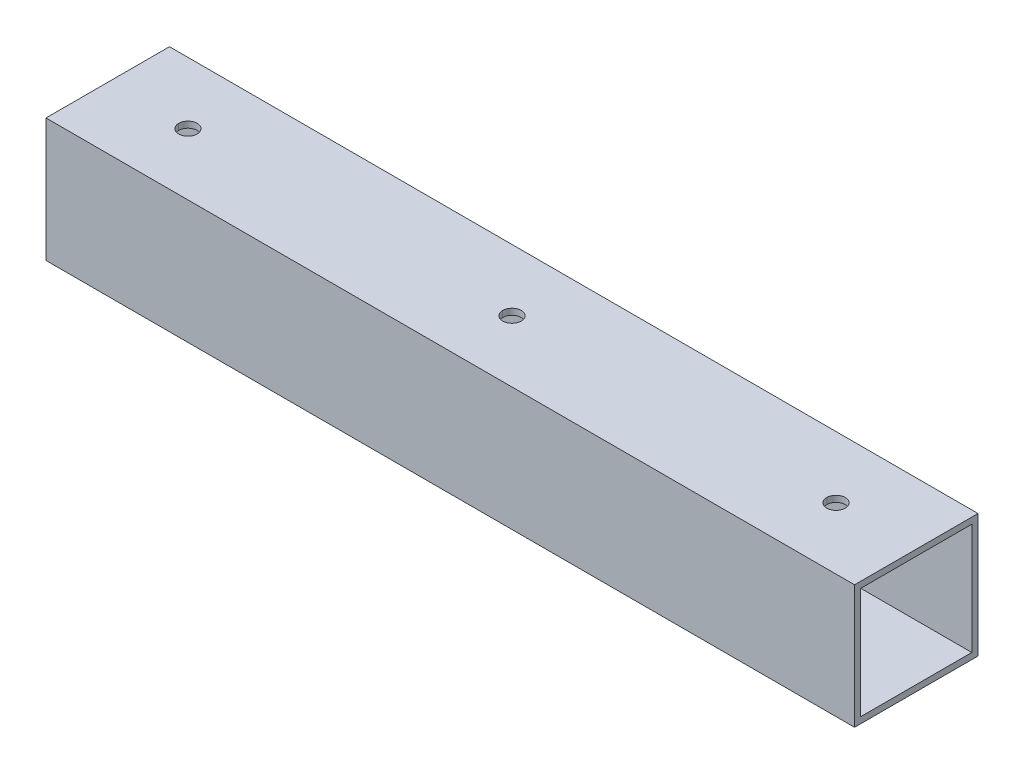
ISO-10303-21;
HEADER;
FILE_DESCRIPTION(('STEP AP214'),'2;1');
FILE_NAME('part.step','',(''),(''),'','','');
FILE_SCHEMA(('AUTOMOTIVE_DESIGN { 1 0 10303 214 1 1 1 1 }'));
ENDSEC;
DATA;
#1=APPLICATION_CONTEXT('core data for automotive mechanical design processes');
#2=APPLICATION_PROTOCOL_DEFINITION('international standard','automotive_design',2000,#1);
#3=PRODUCT_CONTEXT('',#1,'mechanical');
#4=PRODUCT('Part','Part','',(#3));
#5=PRODUCT_RELATED_PRODUCT_CATEGORY('part','',(#4));
#6=PRODUCT_DEFINITION_FORMATION('','',#4);
#7=PRODUCT_DEFINITION_CONTEXT('part definition',#1,'design');
#8=PRODUCT_DEFINITION('design','',#6,#7);
#9=PRODUCT_DEFINITION_SHAPE('','',#8);
#10=(LENGTH_UNIT() NAMED_UNIT(*) SI_UNIT(.MILLI.,.METRE.));
#11=(NAMED_UNIT(*) PLANE_ANGLE_UNIT() SI_UNIT($,.RADIAN.));
#12=(NAMED_UNIT(*) SI_UNIT($,.STERADIAN.) SOLID_ANGLE_UNIT());
#13=UNCERTAINTY_MEASURE_WITH_UNIT(LENGTH_MEASURE(1.E-05),#10,'distance_accuracy_value','');
#14=(GEOMETRIC_REPRESENTATION_CONTEXT(3) GLOBAL_UNCERTAINTY_ASSIGNED_CONTEXT((#13)) GLOBAL_UNIT_ASSIGNED_CONTEXT((#10,
#11,#12)) REPRESENTATION_CONTEXT('',''));
#15=CARTESIAN_POINT('',(0.,0.,0.));
#16=DIRECTION('',(0.,0.,1.));
#17=DIRECTION('',(1.,0.,0.));
#18=AXIS2_PLACEMENT_3D('',#15,#16,#17);
#19=CARTESIAN_POINT('',(-52.5,10.,0.));
#20=DIRECTION('',(0.,1.,0.));
#21=DIRECTION('',(-1.,0.,0.));
#22=AXIS2_PLACEMENT_3D('',#19,#20,#21);
#23=CYLINDRICAL_SURFACE('',#22,1.5);
#24=DIRECTION('',(0.,-1.,0.));
#25=VECTOR('',#24,1.);
#26=CARTESIAN_POINT('',(-51.,-9.,0.));
#27=LINE('',#26,#25);
#28=CARTESIAN_POINT('',(-51.,-9.,0.));
#29=VERTEX_POINT('',#28);
#30=CARTESIAN_POINT('',(-51.,-10.,0.));
#31=VERTEX_POINT('',#30);
#32=EDGE_CURVE('E20',#29,#31,#27,.T.);
#33=ORIENTED_EDGE('',*,*,#32,.F.);
#34=CARTESIAN_POINT('',(-52.5,-9.,0.));
#35=DIRECTION('',(0.,1.,0.));
#36=DIRECTION('',(1.,0.,0.));
#37=AXIS2_PLACEMENT_3D('',#34,#35,#36);
#38=CIRCLE('',#37,1.5);
#39=CARTESIAN_POINT('',(-54.,-9.,0.));
#40=VERTEX_POINT('',#39);
#41=EDGE_CURVE('E34',#29,#40,#38,.T.);
#42=ORIENTED_EDGE('',*,*,#41,.T.);
#43=DIRECTION('',(0.,-1.,0.));
#44=VECTOR('',#43,1.);
#45=CARTESIAN_POINT('',(-54.,-9.,0.));
#46=LINE('',#45,#44);
#47=CARTESIAN_POINT('',(-54.,-10.,0.));
#48=VERTEX_POINT('',#47);
#49=EDGE_CURVE('E11',#40,#48,#46,.T.);
#50=ORIENTED_EDGE('',*,*,#49,.T.);
#51=CARTESIAN_POINT('',(-52.5,-10.,0.));
#52=DIRECTION('',(0.,1.,0.));
#53=DIRECTION('',(1.,0.,0.));
#54=AXIS2_PLACEMENT_3D('',#51,#52,#53);
#55=CIRCLE('',#54,1.5);
#56=EDGE_CURVE('E203',#31,#48,#55,.T.);
#57=ORIENTED_EDGE('',*,*,#56,.F.);
#58=EDGE_LOOP('',(#33,#42,#50,#57));
#59=FACE_BOUND('',#58,.T.);
#60=ADVANCED_FACE('F17',(#59),#23,.F.);
#61=CARTESIAN_POINT('',(-52.5,10.,0.));
#62=DIRECTION('',(0.,1.,0.));
#63=DIRECTION('',(-1.,0.,0.));
#64=AXIS2_PLACEMENT_3D('',#61,#62,#63);
#65=CYLINDRICAL_SURFACE('',#64,1.5);
#66=ORIENTED_EDGE('',*,*,#49,.F.);
#67=CARTESIAN_POINT('',(-52.5,-9.,0.));
#68=DIRECTION('',(0.,1.,0.));
#69=DIRECTION('',(-1.,0.,0.));
#70=AXIS2_PLACEMENT_3D('',#67,#68,#69);
#71=CIRCLE('',#70,1.5);
#72=EDGE_CURVE('E260',#40,#29,#71,.T.);
#73=ORIENTED_EDGE('',*,*,#72,.T.);
#74=ORIENTED_EDGE('',*,*,#32,.T.);
#75=CARTESIAN_POINT('',(-52.5,-10.,0.));
#76=DIRECTION('',(0.,1.,0.));
#77=DIRECTION('',(-1.,0.,0.));
#78=AXIS2_PLACEMENT_3D('',#75,#76,#77);
#79=CIRCLE('',#78,1.5);
#80=EDGE_CURVE('E200',#48,#31,#79,.T.);
#81=ORIENTED_EDGE('',*,*,#80,.F.);
#82=EDGE_LOOP('',(#66,#73,#74,#81));
#83=FACE_BOUND('',#82,.T.);
#84=ADVANCED_FACE('F363',(#83),#65,.F.);
#85=CARTESIAN_POINT('',(52.5,10.,0.));
#86=DIRECTION('',(0.,1.,0.));
#87=DIRECTION('',(-1.,0.,0.));
#88=AXIS2_PLACEMENT_3D('',#85,#86,#87);
#89=CYLINDRICAL_SURFACE('',#88,1.5);
#90=DIRECTION('',(0.,-1.,0.));
#91=VECTOR('',#90,1.);
#92=CARTESIAN_POINT('',(54.,-9.,0.));
#93=LINE('',#92,#91);
#94=CARTESIAN_POINT('',(54.,-9.,0.));
#95=VERTEX_POINT('',#94);
#96=CARTESIAN_POINT('',(54.,-10.,0.));
#97=VERTEX_POINT('',#96);
#98=EDGE_CURVE('E303',#95,#97,#93,.T.);
#99=ORIENTED_EDGE('',*,*,#98,.F.);
#100=CARTESIAN_POINT('',(52.5,-9.,0.));
#101=DIRECTION('',(0.,1.,0.));
#102=DIRECTION('',(1.,0.,0.));
#103=AXIS2_PLACEMENT_3D('',#100,#101,#102);
#104=CIRCLE('',#103,1.5);
#105=CARTESIAN_POINT('',(51.,-9.,0.));
#106=VERTEX_POINT('',#105);
#107=EDGE_CURVE('E258',#95,#106,#104,.T.);
#108=ORIENTED_EDGE('',*,*,#107,.T.);
#109=DIRECTION('',(0.,-1.,0.));
#110=VECTOR('',#109,1.);
#111=CARTESIAN_POINT('',(51.,-9.,0.));
#112=LINE('',#111,#110);
#113=CARTESIAN_POINT('',(51.,-10.,0.));
#114=VERTEX_POINT('',#113);
#115=EDGE_CURVE('E306',#106,#114,#112,.T.);
#116=ORIENTED_EDGE('',*,*,#115,.T.);
#117=CARTESIAN_POINT('',(52.5,-10.,0.));
#118=DIRECTION('',(0.,1.,0.));
#119=DIRECTION('',(1.,0.,0.));
#120=AXIS2_PLACEMENT_3D('',#117,#118,#119);
#121=CIRCLE('',#120,1.5);
#122=EDGE_CURVE('E197',#97,#114,#121,.T.);
#123=ORIENTED_EDGE('',*,*,#122,.F.);
#124=EDGE_LOOP('',(#99,#108,#116,#123));
#125=FACE_BOUND('',#124,.T.);
#126=ADVANCED_FACE('F318',(#125),#89,.F.);
#127=CARTESIAN_POINT('',(52.5,10.,0.));
#128=DIRECTION('',(0.,1.,0.));
#129=DIRECTION('',(-1.,0.,0.));
#130=AXIS2_PLACEMENT_3D('',#127,#128,#129);
#131=CYLINDRICAL_SURFACE('',#130,1.5);
#132=ORIENTED_EDGE('',*,*,#115,.F.);
#133=CARTESIAN_POINT('',(52.5,-9.,0.));
#134=DIRECTION('',(0.,1.,0.));
#135=DIRECTION('',(-1.,0.,0.));
#136=AXIS2_PLACEMENT_3D('',#133,#134,#135);
#137=CIRCLE('',#136,1.5);
#138=EDGE_CURVE('E255',#106,#95,#137,.T.);
#139=ORIENTED_EDGE('',*,*,#138,.T.);
#140=ORIENTED_EDGE('',*,*,#98,.T.);
#141=CARTESIAN_POINT('',(52.5,-10.,0.));
#142=DIRECTION('',(0.,1.,0.));
#143=DIRECTION('',(-1.,0.,0.));
#144=AXIS2_PLACEMENT_3D('',#141,#142,#143);
#145=CIRCLE('',#144,1.5);
#146=EDGE_CURVE('E194',#114,#97,#145,.T.);
#147=ORIENTED_EDGE('',*,*,#146,.F.);
#148=EDGE_LOOP('',(#132,#139,#140,#147));
#149=FACE_BOUND('',#148,.T.);
#150=ADVANCED_FACE('F312',(#149),#131,.F.);
#151=CARTESIAN_POINT('',(0.,10.,0.));
#152=DIRECTION('',(0.,1.,0.));
#153=DIRECTION('',(-1.,0.,0.));
#154=AXIS2_PLACEMENT_3D('',#151,#152,#153);
#155=CYLINDRICAL_SURFACE('',#154,1.5);
#156=DIRECTION('',(0.,-1.,0.));
#157=VECTOR('',#156,1.);
#158=CARTESIAN_POINT('',(1.5,-9.,0.));
#159=LINE('',#158,#157);
#160=CARTESIAN_POINT('',(1.5,-9.,0.));
#161=VERTEX_POINT('',#160);
#162=CARTESIAN_POINT('',(1.5,-10.,0.));
#163=VERTEX_POINT('',#162);
#164=EDGE_CURVE('E300',#161,#163,#159,.T.);
#165=ORIENTED_EDGE('',*,*,#164,.F.);
#166=CARTESIAN_POINT('',(0.,-9.,0.));
#167=DIRECTION('',(0.,1.,0.));
#168=DIRECTION('',(1.,0.,0.));
#169=AXIS2_PLACEMENT_3D('',#166,#167,#168);
#170=CIRCLE('',#169,1.5);
#171=CARTESIAN_POINT('',(-1.5,-9.,0.));
#172=VERTEX_POINT('',#171);
#173=EDGE_CURVE('E253',#161,#172,#170,.T.);
#174=ORIENTED_EDGE('',*,*,#173,.T.);
#175=DIRECTION('',(0.,-1.,0.));
#176=VECTOR('',#175,1.);
#177=CARTESIAN_POINT('',(-1.5,-9.,0.));
#178=LINE('',#177,#176);
#179=CARTESIAN_POINT('',(-1.5,-10.,0.));
#180=VERTEX_POINT('',#179);
#181=EDGE_CURVE('E301',#172,#180,#178,.T.);
#182=ORIENTED_EDGE('',*,*,#181,.T.);
#183=CARTESIAN_POINT('',(0.,-10.,0.));
#184=DIRECTION('',(0.,1.,0.));
#185=DIRECTION('',(1.,0.,0.));
#186=AXIS2_PLACEMENT_3D('',#183,#184,#185);
#187=CIRCLE('',#186,1.5);
#188=EDGE_CURVE('E190',#163,#180,#187,.T.);
#189=ORIENTED_EDGE('',*,*,#188,.F.);
#190=EDGE_LOOP('',(#165,#174,#182,#189));
#191=FACE_BOUND('',#190,.T.);
#192=ADVANCED_FACE('F375',(#191),#155,.F.);
#193=CARTESIAN_POINT('',(0.,10.,0.));
#194=DIRECTION('',(0.,1.,0.));
#195=DIRECTION('',(-1.,0.,0.));
#196=AXIS2_PLACEMENT_3D('',#193,#194,#195);
#197=CYLINDRICAL_SURFACE('',#196,1.5);
#198=ORIENTED_EDGE('',*,*,#181,.F.);
#199=CARTESIAN_POINT('',(0.,-9.,0.));
#200=DIRECTION('',(0.,1.,0.));
#201=DIRECTION('',(-1.,0.,0.));
#202=AXIS2_PLACEMENT_3D('',#199,#200,#201);
#203=CIRCLE('',#202,1.5);
#204=EDGE_CURVE('E250',#172,#161,#203,.T.);
#205=ORIENTED_EDGE('',*,*,#204,.T.);
#206=ORIENTED_EDGE('',*,*,#164,.T.);
#207=CARTESIAN_POINT('',(0.,-10.,0.));
#208=DIRECTION('',(0.,1.,0.));
#209=DIRECTION('',(-1.,0.,0.));
#210=AXIS2_PLACEMENT_3D('',#207,#208,#209);
#211=CIRCLE('',#210,1.5);
#212=EDGE_CURVE('E187',#180,#163,#211,.T.);
#213=ORIENTED_EDGE('',*,*,#212,.F.);
#214=EDGE_LOOP('',(#198,#205,#206,#213));
#215=FACE_BOUND('',#214,.T.);
#216=ADVANCED_FACE('F378',(#215),#197,.F.);
#217=CARTESIAN_POINT('',(-52.5,10.,0.));
#218=DIRECTION('',(0.,1.,0.));
#219=DIRECTION('',(-1.,0.,0.));
#220=AXIS2_PLACEMENT_3D('',#217,#218,#219);
#221=CYLINDRICAL_SURFACE('',#220,1.5);
#222=DIRECTION('',(0.,-1.,0.));
#223=VECTOR('',#222,1.);
#224=CARTESIAN_POINT('',(-54.,10.,0.));
#225=LINE('',#224,#223);
#226=CARTESIAN_POINT('',(-54.,10.,0.));
#227=VERTEX_POINT('',#226);
#228=CARTESIAN_POINT('',(-54.,9.,0.));
#229=VERTEX_POINT('',#228);
#230=EDGE_CURVE('E295',#227,#229,#225,.T.);
#231=ORIENTED_EDGE('',*,*,#230,.T.);
#232=CARTESIAN_POINT('',(-52.5,9.,0.));
#233=DIRECTION('',(0.,1.,0.));
#234=DIRECTION('',(1.,0.,0.));
#235=AXIS2_PLACEMENT_3D('',#232,#233,#234);
#236=CIRCLE('',#235,1.5);
#237=CARTESIAN_POINT('',(-51.,9.,0.));
#238=VERTEX_POINT('',#237);
#239=EDGE_CURVE('E282',#238,#229,#236,.T.);
#240=ORIENTED_EDGE('',*,*,#239,.F.);
#241=DIRECTION('',(0.,-1.,0.));
#242=VECTOR('',#241,1.);
#243=CARTESIAN_POINT('',(-51.,10.,0.));
#244=LINE('',#243,#242);
#245=CARTESIAN_POINT('',(-51.,10.,0.));
#246=VERTEX_POINT('',#245);
#247=EDGE_CURVE('E297',#246,#238,#244,.T.);
#248=ORIENTED_EDGE('',*,*,#247,.F.);
#249=CARTESIAN_POINT('',(-52.5,10.,0.));
#250=DIRECTION('',(0.,1.,0.));
#251=DIRECTION('',(1.,0.,0.));
#252=AXIS2_PLACEMENT_3D('',#249,#250,#251);
#253=CIRCLE('',#252,1.5);
#254=EDGE_CURVE('E225',#246,#227,#253,.T.);
#255=ORIENTED_EDGE('',*,*,#254,.T.);
#256=EDGE_LOOP('',(#231,#240,#248,#255));
#257=FACE_BOUND('',#256,.T.);
#258=ADVANCED_FACE('F382',(#257),#221,.F.);
#259=CARTESIAN_POINT('',(-52.5,10.,0.));
#260=DIRECTION('',(0.,1.,0.));
#261=DIRECTION('',(-1.,0.,0.));
#262=AXIS2_PLACEMENT_3D('',#259,#260,#261);
#263=CYLINDRICAL_SURFACE('',#262,1.5);
#264=ORIENTED_EDGE('',*,*,#247,.T.);
#265=CARTESIAN_POINT('',(-52.5,9.,0.));
#266=DIRECTION('',(0.,1.,0.));
#267=DIRECTION('',(-1.,0.,0.));
#268=AXIS2_PLACEMENT_3D('',#265,#266,#267);
#269=CIRCLE('',#268,1.5);
#270=EDGE_CURVE('E279',#229,#238,#269,.T.);
#271=ORIENTED_EDGE('',*,*,#270,.F.);
#272=ORIENTED_EDGE('',*,*,#230,.F.);
#273=CARTESIAN_POINT('',(-52.5,10.,0.));
#274=DIRECTION('',(0.,1.,0.));
#275=DIRECTION('',(-1.,0.,0.));
#276=AXIS2_PLACEMENT_3D('',#273,#274,#275);
#277=CIRCLE('',#276,1.5);
#278=EDGE_CURVE('E222',#227,#246,#277,.T.);
#279=ORIENTED_EDGE('',*,*,#278,.T.);
#280=EDGE_LOOP('',(#264,#271,#272,#279));
#281=FACE_BOUND('',#280,.T.);
#282=ADVANCED_FACE('F386',(#281),#263,.F.);
#283=CARTESIAN_POINT('',(52.5,10.,0.));
#284=DIRECTION('',(0.,1.,0.));
#285=DIRECTION('',(-1.,0.,0.));
#286=AXIS2_PLACEMENT_3D('',#283,#284,#285);
#287=CYLINDRICAL_SURFACE('',#286,1.5);
#288=DIRECTION('',(0.,-1.,0.));
#289=VECTOR('',#288,1.);
#290=CARTESIAN_POINT('',(51.,10.,0.));
#291=LINE('',#290,#289);
#292=CARTESIAN_POINT('',(51.,10.,0.));
#293=VERTEX_POINT('',#292);
#294=CARTESIAN_POINT('',(51.,9.,0.));
#295=VERTEX_POINT('',#294);
#296=EDGE_CURVE('E290',#293,#295,#291,.T.);
#297=ORIENTED_EDGE('',*,*,#296,.T.);
#298=CARTESIAN_POINT('',(52.5,9.,0.));
#299=DIRECTION('',(0.,1.,0.));
#300=DIRECTION('',(1.,0.,0.));
#301=AXIS2_PLACEMENT_3D('',#298,#299,#300);
#302=CIRCLE('',#301,1.5);
#303=CARTESIAN_POINT('',(54.,9.,0.));
#304=VERTEX_POINT('',#303);
#305=EDGE_CURVE('E276',#304,#295,#302,.T.);
#306=ORIENTED_EDGE('',*,*,#305,.F.);
#307=DIRECTION('',(0.,-1.,0.));
#308=VECTOR('',#307,1.);
#309=CARTESIAN_POINT('',(54.,10.,0.));
#310=LINE('',#309,#308);
#311=CARTESIAN_POINT('',(54.,10.,0.));
#312=VERTEX_POINT('',#311);
#313=EDGE_CURVE('E292',#312,#304,#310,.T.);
#314=ORIENTED_EDGE('',*,*,#313,.F.);
#315=CARTESIAN_POINT('',(52.5,10.,0.));
#316=DIRECTION('',(0.,1.,0.));
#317=DIRECTION('',(1.,0.,0.));
#318=AXIS2_PLACEMENT_3D('',#315,#316,#317);
#319=CIRCLE('',#318,1.5);
#320=EDGE_CURVE('E220',#312,#293,#319,.T.);
#321=ORIENTED_EDGE('',*,*,#320,.T.);
#322=EDGE_LOOP('',(#297,#306,#314,#321));
#323=FACE_BOUND('',#322,.T.);
#324=ADVANCED_FACE('F390',(#323),#287,.F.);
#325=CARTESIAN_POINT('',(52.5,10.,0.));
#326=DIRECTION('',(0.,1.,0.));
#327=DIRECTION('',(-1.,0.,0.));
#328=AXIS2_PLACEMENT_3D('',#325,#326,#327);
#329=CYLINDRICAL_SURFACE('',#328,1.5);
#330=ORIENTED_EDGE('',*,*,#313,.T.);
#331=CARTESIAN_POINT('',(52.5,9.,0.));
#332=DIRECTION('',(0.,1.,0.));
#333=DIRECTION('',(-1.,0.,0.));
#334=AXIS2_PLACEMENT_3D('',#331,#332,#333);
#335=CIRCLE('',#334,1.5);
#336=EDGE_CURVE('E273',#295,#304,#335,.T.);
#337=ORIENTED_EDGE('',*,*,#336,.F.);
#338=ORIENTED_EDGE('',*,*,#296,.F.);
#339=CARTESIAN_POINT('',(52.5,10.,0.));
#340=DIRECTION('',(0.,1.,0.));
#341=DIRECTION('',(-1.,0.,0.));
#342=AXIS2_PLACEMENT_3D('',#339,#340,#341);
#343=CIRCLE('',#342,1.5);
#344=EDGE_CURVE('E217',#293,#312,#343,.T.);
#345=ORIENTED_EDGE('',*,*,#344,.T.);
#346=EDGE_LOOP('',(#330,#337,#338,#345));
#347=FACE_BOUND('',#346,.T.);
#348=ADVANCED_FACE('F394',(#347),#329,.F.);
#349=CARTESIAN_POINT('',(0.,10.,0.));
#350=DIRECTION('',(0.,1.,0.));
#351=DIRECTION('',(-1.,0.,0.));
#352=AXIS2_PLACEMENT_3D('',#349,#350,#351);
#353=CYLINDRICAL_SURFACE('',#352,1.5);
#354=DIRECTION('',(0.,-1.,0.));
#355=VECTOR('',#354,1.);
#356=CARTESIAN_POINT('',(-1.5,10.,0.));
#357=LINE('',#356,#355);
#358=CARTESIAN_POINT('',(-1.5,10.,0.));
#359=VERTEX_POINT('',#358);
#360=CARTESIAN_POINT('',(-1.5,9.,0.));
#361=VERTEX_POINT('',#360);
#362=EDGE_CURVE('E285',#359,#361,#357,.T.);
#363=ORIENTED_EDGE('',*,*,#362,.T.);
#364=CARTESIAN_POINT('',(0.,9.,0.));
#365=DIRECTION('',(0.,1.,0.));
#366=DIRECTION('',(1.,0.,0.));
#367=AXIS2_PLACEMENT_3D('',#364,#365,#366);
#368=CIRCLE('',#367,1.5);
#369=CARTESIAN_POINT('',(1.5,9.,0.));
#370=VERTEX_POINT('',#369);
#371=EDGE_CURVE('E270',#370,#361,#368,.T.);
#372=ORIENTED_EDGE('',*,*,#371,.F.);
#373=DIRECTION('',(0.,-1.,0.));
#374=VECTOR('',#373,1.);
#375=CARTESIAN_POINT('',(1.5,10.,0.));
#376=LINE('',#375,#374);
#377=CARTESIAN_POINT('',(1.5,10.,0.));
#378=VERTEX_POINT('',#377);
#379=EDGE_CURVE('E287',#378,#370,#376,.T.);
#380=ORIENTED_EDGE('',*,*,#379,.F.);
#381=CARTESIAN_POINT('',(0.,10.,0.));
#382=DIRECTION('',(0.,1.,0.));
#383=DIRECTION('',(1.,0.,0.));
#384=AXIS2_PLACEMENT_3D('',#381,#382,#383);
#385=CIRCLE('',#384,1.5);
#386=EDGE_CURVE('E215',#378,#359,#385,.T.);
#387=ORIENTED_EDGE('',*,*,#386,.T.);
#388=EDGE_LOOP('',(#363,#372,#380,#387));
#389=FACE_BOUND('',#388,.T.);
#390=ADVANCED_FACE('F358',(#389),#353,.F.);
#391=CARTESIAN_POINT('',(0.,10.,0.));
#392=DIRECTION('',(0.,1.,0.));
#393=DIRECTION('',(-1.,0.,0.));
#394=AXIS2_PLACEMENT_3D('',#391,#392,#393);
#395=CYLINDRICAL_SURFACE('',#394,1.5);
#396=ORIENTED_EDGE('',*,*,#379,.T.);
#397=CARTESIAN_POINT('',(0.,9.,0.));
#398=DIRECTION('',(0.,1.,0.));
#399=DIRECTION('',(-1.,0.,0.));
#400=AXIS2_PLACEMENT_3D('',#397,#398,#399);
#401=CIRCLE('',#400,1.5);
#402=EDGE_CURVE('E265',#361,#370,#401,.T.);
#403=ORIENTED_EDGE('',*,*,#402,.F.);
#404=ORIENTED_EDGE('',*,*,#362,.F.);
#405=CARTESIAN_POINT('',(0.,10.,0.));
#406=DIRECTION('',(0.,1.,0.));
#407=DIRECTION('',(-1.,0.,0.));
#408=AXIS2_PLACEMENT_3D('',#405,#406,#407);
#409=CIRCLE('',#408,1.5);
#410=EDGE_CURVE('E212',#359,#378,#409,.T.);
#411=ORIENTED_EDGE('',*,*,#410,.T.);
#412=EDGE_LOOP('',(#396,#403,#404,#411));
#413=FACE_BOUND('',#412,.T.);
#414=ADVANCED_FACE('F349',(#413),#395,.F.);
#415=CARTESIAN_POINT('',(-65.5,9.,9.));
#416=DIRECTION('',(0.,-1.,0.));
#417=DIRECTION('',(0.,0.,-1.));
#418=AXIS2_PLACEMENT_3D('',#415,#416,#417);
#419=PLANE('',#418);
#420=ORIENTED_EDGE('',*,*,#239,.T.);
#421=ORIENTED_EDGE('',*,*,#270,.T.);
#422=EDGE_LOOP('',(#420,#421));
#423=FACE_BOUND('',#422,.T.);
#424=ORIENTED_EDGE('',*,*,#305,.T.);
#425=ORIENTED_EDGE('',*,*,#336,.T.);
#426=EDGE_LOOP('',(#424,#425));
#427=FACE_BOUND('',#426,.T.);
#428=ORIENTED_EDGE('',*,*,#371,.T.);
#429=ORIENTED_EDGE('',*,*,#402,.T.);
#430=EDGE_LOOP('',(#428,#429));
#431=FACE_BOUND('',#430,.T.);
#432=DIRECTION('',(1.,0.,0.));
#433=VECTOR('',#432,1.);
#434=CARTESIAN_POINT('',(-65.5,9.,-9.));
#435=LINE('',#434,#433);
#436=CARTESIAN_POINT('',(-65.5,9.,-9.));
#437=VERTEX_POINT('',#436);
#438=CARTESIAN_POINT('',(65.5,9.,-9.));
#439=VERTEX_POINT('',#438);
#440=EDGE_CURVE('E263',#437,#439,#435,.T.);
#441=ORIENTED_EDGE('',*,*,#440,.T.);
#442=DIRECTION('',(0.,0.,-1.));
#443=VECTOR('',#442,1.);
#444=CARTESIAN_POINT('',(65.5,9.,9.));
#445=LINE('',#444,#443);
#446=CARTESIAN_POINT('',(65.5,9.,9.));
#447=VERTEX_POINT('',#446);
#448=EDGE_CURVE('E242',#447,#439,#445,.T.);
#449=ORIENTED_EDGE('',*,*,#448,.F.);
#450=DIRECTION('',(1.,0.,0.));
#451=VECTOR('',#450,1.);
#452=CARTESIAN_POINT('',(-65.5,9.,9.));
#453=LINE('',#452,#451);
#454=CARTESIAN_POINT('',(-65.5,9.,9.));
#455=VERTEX_POINT('',#454);
#456=EDGE_CURVE('E247',#455,#447,#453,.T.);
#457=ORIENTED_EDGE('',*,*,#456,.F.);
#458=DIRECTION('',(0.,0.,-1.));
#459=VECTOR('',#458,1.);
#460=CARTESIAN_POINT('',(-65.5,9.,9.));
#461=LINE('',#460,#459);
#462=EDGE_CURVE('E182',#455,#437,#461,.T.);
#463=ORIENTED_EDGE('',*,*,#462,.T.);
#464=EDGE_LOOP('',(#441,#449,#457,#463));
#465=FACE_BOUND('',#464,.T.);
#466=ADVANCED_FACE('F347',(#423,#427,#431,#465),#419,.T.);
#467=CARTESIAN_POINT('',(-65.5,9.,-9.));
#468=DIRECTION('',(0.,0.,1.));
#469=DIRECTION('',(0.,-1.,0.));
#470=AXIS2_PLACEMENT_3D('',#467,#468,#469);
#471=PLANE('',#470);
#472=DIRECTION('',(1.,0.,0.));
#473=VECTOR('',#472,1.);
#474=CARTESIAN_POINT('',(-65.5,-9.,-9.));
#475=LINE('',#474,#473);
#476=CARTESIAN_POINT('',(-65.5,-9.,-9.));
#477=VERTEX_POINT('',#476);
#478=CARTESIAN_POINT('',(65.5,-9.,-9.));
#479=VERTEX_POINT('',#478);
#480=EDGE_CURVE('E248',#477,#479,#475,.T.);
#481=ORIENTED_EDGE('',*,*,#480,.T.);
#482=DIRECTION('',(0.,-1.,0.));
#483=VECTOR('',#482,1.);
#484=CARTESIAN_POINT('',(65.5,9.,-9.));
#485=LINE('',#484,#483);
#486=EDGE_CURVE('E239',#439,#479,#485,.T.);
#487=ORIENTED_EDGE('',*,*,#486,.F.);
#488=ORIENTED_EDGE('',*,*,#440,.F.);
#489=DIRECTION('',(0.,-1.,0.));
#490=VECTOR('',#489,1.);
#491=CARTESIAN_POINT('',(-65.5,9.,-9.));
#492=LINE('',#491,#490);
#493=EDGE_CURVE('E184',#437,#477,#492,.T.);
#494=ORIENTED_EDGE('',*,*,#493,.T.);
#495=EDGE_LOOP('',(#481,#487,#488,#494));
#496=FACE_BOUND('',#495,.T.);
#497=ADVANCED_FACE('F324',(#496),#471,.T.);
#498=CARTESIAN_POINT('',(-65.5,-9.,-9.));
#499=DIRECTION('',(0.,1.,0.));
#500=DIRECTION('',(0.,0.,1.));
#501=AXIS2_PLACEMENT_3D('',#498,#499,#500);
#502=PLANE('',#501);
#503=ORIENTED_EDGE('',*,*,#41,.F.);
#504=ORIENTED_EDGE('',*,*,#72,.F.);
#505=EDGE_LOOP('',(#503,#504));
#506=FACE_BOUND('',#505,.T.);
#507=ORIENTED_EDGE('',*,*,#107,.F.);
#508=ORIENTED_EDGE('',*,*,#138,.F.);
#509=EDGE_LOOP('',(#507,#508));
#510=FACE_BOUND('',#509,.T.);
#511=ORIENTED_EDGE('',*,*,#173,.F.);
#512=ORIENTED_EDGE('',*,*,#204,.F.);
#513=EDGE_LOOP('',(#511,#512));
#514=FACE_BOUND('',#513,.T.);
#515=DIRECTION('',(1.,0.,0.));
#516=VECTOR('',#515,1.);
#517=CARTESIAN_POINT('',(-65.5,-9.,9.));
#518=LINE('',#517,#516);
#519=CARTESIAN_POINT('',(-65.5,-9.,9.));
#520=VERTEX_POINT('',#519);
#521=CARTESIAN_POINT('',(65.5,-9.,9.));
#522=VERTEX_POINT('',#521);
#523=EDGE_CURVE('E245',#520,#522,#518,.T.);
#524=ORIENTED_EDGE('',*,*,#523,.T.);
#525=DIRECTION('',(0.,0.,1.));
#526=VECTOR('',#525,1.);
#527=CARTESIAN_POINT('',(65.5,-9.,-9.));
#528=LINE('',#527,#526);
#529=EDGE_CURVE('E236',#479,#522,#528,.T.);
#530=ORIENTED_EDGE('',*,*,#529,.F.);
#531=ORIENTED_EDGE('',*,*,#480,.F.);
#532=DIRECTION('',(0.,0.,1.));
#533=VECTOR('',#532,1.);
#534=CARTESIAN_POINT('',(-65.5,-9.,-9.));
#535=LINE('',#534,#533);
#536=EDGE_CURVE('E172',#477,#520,#535,.T.);
#537=ORIENTED_EDGE('',*,*,#536,.T.);
#538=EDGE_LOOP('',(#524,#530,#531,#537));
#539=FACE_BOUND('',#538,.T.);
#540=ADVANCED_FACE('F320',(#506,#510,#514,#539),#502,.T.);
#541=CARTESIAN_POINT('',(-65.5,-9.,9.));
#542=DIRECTION('',(0.,0.,-1.));
#543=DIRECTION('',(0.,1.,0.));
#544=AXIS2_PLACEMENT_3D('',#541,#542,#543);
#545=PLANE('',#544);
#546=ORIENTED_EDGE('',*,*,#456,.T.);
#547=DIRECTION('',(0.,1.,0.));
#548=VECTOR('',#547,1.);
#549=CARTESIAN_POINT('',(65.5,-9.,9.));
#550=LINE('',#549,#548);
#551=EDGE_CURVE('E233',#522,#447,#550,.T.);
#552=ORIENTED_EDGE('',*,*,#551,.F.);
#553=ORIENTED_EDGE('',*,*,#523,.F.);
#554=DIRECTION('',(0.,1.,0.));
#555=VECTOR('',#554,1.);
#556=CARTESIAN_POINT('',(-65.5,-9.,9.));
#557=LINE('',#556,#555);
#558=EDGE_CURVE('E162',#520,#455,#557,.T.);
#559=ORIENTED_EDGE('',*,*,#558,.T.);
#560=EDGE_LOOP('',(#546,#552,#553,#559));
#561=FACE_BOUND('',#560,.T.);
#562=ADVANCED_FACE('F323',(#561),#545,.T.);
#563=CARTESIAN_POINT('',(65.5,0.,0.));
#564=DIRECTION('',(1.,0.,0.));
#565=DIRECTION('',(0.,1.,0.));
#566=AXIS2_PLACEMENT_3D('',#563,#564,#565);
#567=PLANE('',#566);
#568=ORIENTED_EDGE('',*,*,#448,.T.);
#569=ORIENTED_EDGE('',*,*,#486,.T.);
#570=ORIENTED_EDGE('',*,*,#529,.T.);
#571=ORIENTED_EDGE('',*,*,#551,.T.);
#572=EDGE_LOOP('',(#568,#569,#570,#571));
#573=FACE_BOUND('',#572,.T.);
#574=DIRECTION('',(0.,1.,0.));
#575=VECTOR('',#574,1.);
#576=CARTESIAN_POINT('',(65.5,-10.,-10.));
#577=LINE('',#576,#575);
#578=CARTESIAN_POINT('',(65.5,-10.,-10.));
#579=VERTEX_POINT('',#578);
#580=CARTESIAN_POINT('',(65.5,10.,-10.));
#581=VERTEX_POINT('',#580);
#582=EDGE_CURVE('E227',#579,#581,#577,.T.);
#583=ORIENTED_EDGE('',*,*,#582,.T.);
#584=DIRECTION('',(0.,0.,1.));
#585=VECTOR('',#584,1.);
#586=CARTESIAN_POINT('',(65.5,10.,-10.));
#587=LINE('',#586,#585);
#588=CARTESIAN_POINT('',(65.5,10.,10.));
#589=VERTEX_POINT('',#588);
#590=EDGE_CURVE('E211',#581,#589,#587,.T.);
#591=ORIENTED_EDGE('',*,*,#590,.T.);
#592=DIRECTION('',(0.,-1.,0.));
#593=VECTOR('',#592,1.);
#594=CARTESIAN_POINT('',(65.5,10.,10.));
#595=LINE('',#594,#593);
#596=CARTESIAN_POINT('',(65.5,-10.,10.));
#597=VERTEX_POINT('',#596);
#598=EDGE_CURVE('E207',#589,#597,#595,.T.);
#599=ORIENTED_EDGE('',*,*,#598,.T.);
#600=DIRECTION('',(0.,0.,-1.));
#601=VECTOR('',#600,1.);
#602=CARTESIAN_POINT('',(65.5,-10.,10.));
#603=LINE('',#602,#601);
#604=EDGE_CURVE('E171',#597,#579,#603,.T.);
#605=ORIENTED_EDGE('',*,*,#604,.T.);
#606=EDGE_LOOP('',(#583,#591,#599,#605));
#607=FACE_BOUND('',#606,.T.);
#608=ADVANCED_FACE('F338',(#573,#607),#567,.T.);
#609=CARTESIAN_POINT('',(-65.5,-10.,-10.));
#610=DIRECTION('',(0.,0.,-1.));
#611=DIRECTION('',(0.,1.,0.));
#612=AXIS2_PLACEMENT_3D('',#609,#610,#611);
#613=PLANE('',#612);
#614=DIRECTION('',(1.,0.,0.));
#615=VECTOR('',#614,1.);
#616=CARTESIAN_POINT('',(-65.5,10.,-10.));
#617=LINE('',#616,#615);
#618=CARTESIAN_POINT('',(-65.5,10.,-10.));
#619=VERTEX_POINT('',#618);
#620=EDGE_CURVE('E208',#619,#581,#617,.T.);
#621=ORIENTED_EDGE('',*,*,#620,.T.);
#622=ORIENTED_EDGE('',*,*,#582,.F.);
#623=DIRECTION('',(1.,0.,0.));
#624=VECTOR('',#623,1.);
#625=CARTESIAN_POINT('',(-65.5,-10.,-10.));
#626=LINE('',#625,#624);
#627=CARTESIAN_POINT('',(-65.5,-10.,-10.));
#628=VERTEX_POINT('',#627);
#629=EDGE_CURVE('E191',#628,#579,#626,.T.);
#630=ORIENTED_EDGE('',*,*,#629,.F.);
#631=DIRECTION('',(0.,1.,0.));
#632=VECTOR('',#631,1.);
#633=CARTESIAN_POINT('',(-65.5,-10.,-10.));
#634=LINE('',#633,#632);
#635=EDGE_CURVE('E175',#628,#619,#634,.T.);
#636=ORIENTED_EDGE('',*,*,#635,.T.);
#637=EDGE_LOOP('',(#621,#622,#630,#636));
#638=FACE_BOUND('',#637,.T.);
#639=ADVANCED_FACE('F412',(#638),#613,.T.);
#640=CARTESIAN_POINT('',(-65.5,10.,-10.));
#641=DIRECTION('',(0.,1.,0.));
#642=DIRECTION('',(0.,0.,1.));
#643=AXIS2_PLACEMENT_3D('',#640,#641,#642);
#644=PLANE('',#643);
#645=ORIENTED_EDGE('',*,*,#254,.F.);
#646=ORIENTED_EDGE('',*,*,#278,.F.);
#647=EDGE_LOOP('',(#645,#646));
#648=FACE_BOUND('',#647,.T.);
#649=ORIENTED_EDGE('',*,*,#320,.F.);
#650=ORIENTED_EDGE('',*,*,#344,.F.);
#651=EDGE_LOOP('',(#649,#650));
#652=FACE_BOUND('',#651,.T.);
#653=ORIENTED_EDGE('',*,*,#386,.F.);
#654=ORIENTED_EDGE('',*,*,#410,.F.);
#655=EDGE_LOOP('',(#653,#654));
#656=FACE_BOUND('',#655,.T.);
#657=DIRECTION('',(1.,0.,0.));
#658=VECTOR('',#657,1.);
#659=CARTESIAN_POINT('',(-65.5,10.,10.));
#660=LINE('',#659,#658);
#661=CARTESIAN_POINT('',(-65.5,10.,10.));
#662=VERTEX_POINT('',#661);
#663=EDGE_CURVE('E158',#662,#589,#660,.T.);
#664=ORIENTED_EDGE('',*,*,#663,.T.);
#665=ORIENTED_EDGE('',*,*,#590,.F.);
#666=ORIENTED_EDGE('',*,*,#620,.F.);
#667=DIRECTION('',(0.,0.,1.));
#668=VECTOR('',#667,1.);
#669=CARTESIAN_POINT('',(-65.5,10.,-10.));
#670=LINE('',#669,#668);
#671=EDGE_CURVE('E163',#619,#662,#670,.T.);
#672=ORIENTED_EDGE('',*,*,#671,.T.);
#673=EDGE_LOOP('',(#664,#665,#666,#672));
#674=FACE_BOUND('',#673,.T.);
#675=ADVANCED_FACE('F409',(#648,#652,#656,#674),#644,.T.);
#676=CARTESIAN_POINT('',(-65.5,10.,10.));
#677=DIRECTION('',(0.,0.,1.));
#678=DIRECTION('',(0.,-1.,0.));
#679=AXIS2_PLACEMENT_3D('',#676,#677,#678);
#680=PLANE('',#679);
#681=DIRECTION('',(1.,0.,0.));
#682=VECTOR('',#681,1.);
#683=CARTESIAN_POINT('',(-65.5,-10.,10.));
#684=LINE('',#683,#682);
#685=CARTESIAN_POINT('',(-65.5,-10.,10.));
#686=VERTEX_POINT('',#685);
#687=EDGE_CURVE('E155',#686,#597,#684,.T.);
#688=ORIENTED_EDGE('',*,*,#687,.T.);
#689=ORIENTED_EDGE('',*,*,#598,.F.);
#690=ORIENTED_EDGE('',*,*,#663,.F.);
#691=DIRECTION('',(0.,-1.,0.));
#692=VECTOR('',#691,1.);
#693=CARTESIAN_POINT('',(-65.5,10.,10.));
#694=LINE('',#693,#692);
#695=EDGE_CURVE('E151',#662,#686,#694,.T.);
#696=ORIENTED_EDGE('',*,*,#695,.T.);
#697=EDGE_LOOP('',(#688,#689,#690,#696));
#698=FACE_BOUND('',#697,.T.);
#699=ADVANCED_FACE('F153',(#698),#680,.T.);
#700=CARTESIAN_POINT('',(-65.5,-10.,10.));
#701=DIRECTION('',(0.,-1.,0.));
#702=DIRECTION('',(0.,0.,-1.));
#703=AXIS2_PLACEMENT_3D('',#700,#701,#702);
#704=PLANE('',#703);
#705=ORIENTED_EDGE('',*,*,#56,.T.);
#706=ORIENTED_EDGE('',*,*,#80,.T.);
#707=EDGE_LOOP('',(#705,#706));
#708=FACE_BOUND('',#707,.T.);
#709=ORIENTED_EDGE('',*,*,#122,.T.);
#710=ORIENTED_EDGE('',*,*,#146,.T.);
#711=EDGE_LOOP('',(#709,#710));
#712=FACE_BOUND('',#711,.T.);
#713=ORIENTED_EDGE('',*,*,#188,.T.);
#714=ORIENTED_EDGE('',*,*,#212,.T.);
#715=EDGE_LOOP('',(#713,#714));
#716=FACE_BOUND('',#715,.T.);
#717=ORIENTED_EDGE('',*,*,#629,.T.);
#718=ORIENTED_EDGE('',*,*,#604,.F.);
#719=ORIENTED_EDGE('',*,*,#687,.F.);
#720=DIRECTION('',(0.,0.,-1.));
#721=VECTOR('',#720,1.);
#722=CARTESIAN_POINT('',(-65.5,-10.,10.));
#723=LINE('',#722,#721);
#724=EDGE_CURVE('E169',#686,#628,#723,.T.);
#725=ORIENTED_EDGE('',*,*,#724,.T.);
#726=EDGE_LOOP('',(#717,#718,#719,#725));
#727=FACE_BOUND('',#726,.T.);
#728=ADVANCED_FACE('F168',(#708,#712,#716,#727),#704,.T.);
#729=CARTESIAN_POINT('',(-65.5,0.,0.));
#730=DIRECTION('',(1.,0.,0.));
#731=DIRECTION('',(0.,1.,0.));
#732=AXIS2_PLACEMENT_3D('',#729,#730,#731);
#733=PLANE('',#732);
#734=ORIENTED_EDGE('',*,*,#536,.F.);
#735=ORIENTED_EDGE('',*,*,#493,.F.);
#736=ORIENTED_EDGE('',*,*,#462,.F.);
#737=ORIENTED_EDGE('',*,*,#558,.F.);
#738=EDGE_LOOP('',(#734,#735,#736,#737));
#739=FACE_BOUND('',#738,.T.);
#740=ORIENTED_EDGE('',*,*,#695,.F.);
#741=ORIENTED_EDGE('',*,*,#671,.F.);
#742=ORIENTED_EDGE('',*,*,#635,.F.);
#743=ORIENTED_EDGE('',*,*,#724,.F.);
#744=EDGE_LOOP('',(#740,#741,#742,#743));
#745=FACE_BOUND('',#744,.T.);
#746=ADVANCED_FACE('F174',(#739,#745),#733,.F.);
#747=CLOSED_SHELL('',(#60,#84,#126,#150,#192,#216,#258,#282,#324,#348,#390,#414,#466,#497,#540,
#562,#608,#639,#675,#699,#728,#746));
#748=MANIFOLD_SOLID_BREP('B1',#747);
#749=ADVANCED_BREP_SHAPE_REPRESENTATION('',(#18,#748),#14);
#750=SHAPE_DEFINITION_REPRESENTATION(#9,#749);
ENDSEC;
END-ISO-10303-21;
